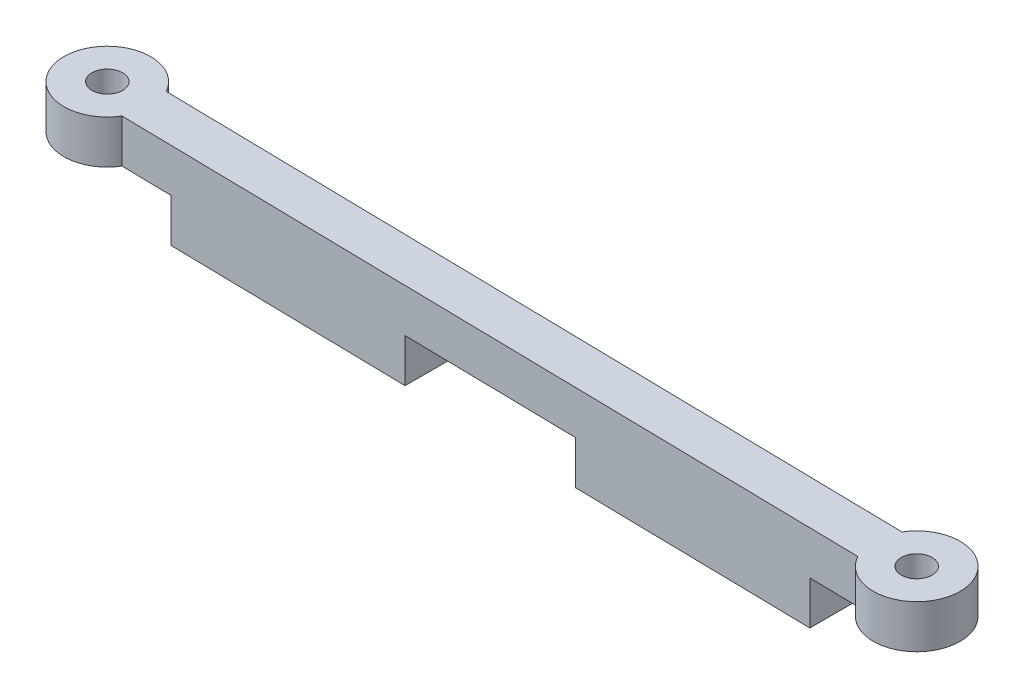
ISO-10303-21;
HEADER;
FILE_DESCRIPTION(('STEP AP214'),'2;1');
FILE_NAME('part.step','',(''),(''),'','','');
FILE_SCHEMA(('AUTOMOTIVE_DESIGN { 1 0 10303 214 1 1 1 1 }'));
ENDSEC;
DATA;
#1=APPLICATION_CONTEXT('core data for automotive mechanical design processes');
#2=APPLICATION_PROTOCOL_DEFINITION('international standard','automotive_design',2000,#1);
#3=PRODUCT_CONTEXT('',#1,'mechanical');
#4=PRODUCT('Part','Part','',(#3));
#5=PRODUCT_RELATED_PRODUCT_CATEGORY('part','',(#4));
#6=PRODUCT_DEFINITION_FORMATION('','',#4);
#7=PRODUCT_DEFINITION_CONTEXT('part definition',#1,'design');
#8=PRODUCT_DEFINITION('design','',#6,#7);
#9=PRODUCT_DEFINITION_SHAPE('','',#8);
#10=(LENGTH_UNIT() NAMED_UNIT(*) SI_UNIT(.MILLI.,.METRE.));
#11=(NAMED_UNIT(*) PLANE_ANGLE_UNIT() SI_UNIT($,.RADIAN.));
#12=(NAMED_UNIT(*) SI_UNIT($,.STERADIAN.) SOLID_ANGLE_UNIT());
#13=UNCERTAINTY_MEASURE_WITH_UNIT(LENGTH_MEASURE(1.E-05),#10,'distance_accuracy_value','');
#14=(GEOMETRIC_REPRESENTATION_CONTEXT(3) GLOBAL_UNCERTAINTY_ASSIGNED_CONTEXT((#13)) GLOBAL_UNIT_ASSIGNED_CONTEXT((#10,
#11,#12)) REPRESENTATION_CONTEXT('',''));
#15=CARTESIAN_POINT('',(0.,0.,0.));
#16=DIRECTION('',(0.,0.,1.));
#17=DIRECTION('',(1.,0.,0.));
#18=AXIS2_PLACEMENT_3D('',#15,#16,#17);
#19=CARTESIAN_POINT('',(0.,0.,0.));
#20=DIRECTION('',(0.,1.,0.));
#21=DIRECTION('',(0.,0.,1.));
#22=AXIS2_PLACEMENT_3D('',#19,#20,#21);
#23=PLANE('',#22);
#24=DIRECTION('',(0.99983433393639,0.,0.0182017768905994));
#25=VECTOR('',#24,1.);
#26=CARTESIAN_POINT('',(-0.0577810676795412,0.,3.17394810763473));
#27=LINE('',#26,#25);
#28=CARTESIAN_POINT('',(73.025,0.,4.50440499472844));
#29=VERTEX_POINT('',#28);
#30=CARTESIAN_POINT('',(107.95,0.,5.14020738351161));
#31=VERTEX_POINT('',#30);
#32=EDGE_CURVE('E251',#29,#31,#27,.T.);
#33=ORIENTED_EDGE('',*,*,#32,.F.);
#34=DIRECTION('',(0.,0.,1.));
#35=VECTOR('',#34,1.);
#36=CARTESIAN_POINT('',(73.025,0.,-1.84559500527155));
#37=LINE('',#36,#35);
#38=CARTESIAN_POINT('',(73.025,0.,-1.84559500527155));
#39=VERTEX_POINT('',#38);
#40=EDGE_CURVE('E167',#39,#29,#37,.T.);
#41=ORIENTED_EDGE('',*,*,#40,.F.);
#42=DIRECTION('',(-0.99983433393639,0.,-0.0182017768905994));
#43=VECTOR('',#42,1.);
#44=CARTESIAN_POINT('',(0.0577810676795413,0.,-3.17394810763473));
#45=LINE('',#44,#43);
#46=CARTESIAN_POINT('',(107.95,0.,-1.20979261648838));
#47=VERTEX_POINT('',#46);
#48=EDGE_CURVE('E248',#47,#39,#45,.T.);
#49=ORIENTED_EDGE('',*,*,#48,.F.);
#50=DIRECTION('',(0.,0.,1.));
#51=VECTOR('',#50,1.);
#52=CARTESIAN_POINT('',(107.95,0.,-1.20979261648838));
#53=LINE('',#52,#51);
#54=EDGE_CURVE('E184',#47,#31,#53,.T.);
#55=ORIENTED_EDGE('',*,*,#54,.T.);
#56=EDGE_LOOP('',(#33,#41,#49,#55));
#57=FACE_BOUND('',#56,.T.);
#58=ADVANCED_FACE('F60',(#57),#23,.F.);
#59=CARTESIAN_POINT('',(120.65,12.7,2.19640825216004));
#60=DIRECTION('',(0.,-1.,0.));
#61=DIRECTION('',(0.,0.,-1.));
#62=AXIS2_PLACEMENT_3D('',#59,#60,#61);
#63=CYLINDRICAL_SURFACE('',#62,6.35000000000001);
#64=CARTESIAN_POINT('',(120.65,6.35,2.19640825216004));
#65=DIRECTION('',(0.,-1.,0.));
#66=DIRECTION('',(0.,0.,-1.));
#67=AXIS2_PLACEMENT_3D('',#64,#65,#66);
#68=CIRCLE('',#67,6.35000000000001);
#69=CARTESIAN_POINT('',(115.20912719814,6.35,-1.07764170988686));
#70=VERTEX_POINT('',#69);
#71=CARTESIAN_POINT('',(115.093565062781,6.35,5.27025450538259));
#72=VERTEX_POINT('',#71);
#73=EDGE_CURVE('E216',#70,#72,#68,.T.);
#74=ORIENTED_EDGE('',*,*,#73,.F.);
#75=CARTESIAN_POINT('',(115.20912719814,12.7,-1.07764170988686));
#76=DIRECTION('',(0.,-1.,0.));
#77=VECTOR('',#76,1.);
#78=LINE('',#75,#77);
#79=CARTESIAN_POINT('',(115.20912719814,12.7,-1.07764170988686));
#80=VERTEX_POINT('',#79);
#81=EDGE_CURVE('E70',#80,#70,#78,.T.);
#82=ORIENTED_EDGE('',*,*,#81,.F.);
#83=CARTESIAN_POINT('',(120.65,12.7,2.19640825216004));
#84=DIRECTION('',(0.,1.,0.));
#85=DIRECTION('',(0.,0.,1.));
#86=AXIS2_PLACEMENT_3D('',#83,#84,#85);
#87=CIRCLE('',#86,6.35000000000001);
#88=CARTESIAN_POINT('',(115.093565062781,12.7,5.27025450538259));
#89=VERTEX_POINT('',#88);
#90=EDGE_CURVE('E222',#89,#80,#87,.T.);
#91=ORIENTED_EDGE('',*,*,#90,.F.);
#92=CARTESIAN_POINT('',(115.093565062781,12.7,5.2702545053826));
#93=DIRECTION('',(0.,-1.,0.));
#94=VECTOR('',#93,1.);
#95=LINE('',#92,#94);
#96=EDGE_CURVE('E241',#89,#72,#95,.T.);
#97=ORIENTED_EDGE('',*,*,#96,.T.);
#98=EDGE_LOOP('',(#74,#82,#91,#97));
#99=FACE_BOUND('',#98,.T.);
#100=ADVANCED_FACE('F287',(#99),#63,.T.);
#101=CARTESIAN_POINT('',(0.0577810676795413,12.7,-3.17394810763473));
#102=DIRECTION('',(-0.0182017768905994,0.,0.99983433393639));
#103=DIRECTION('',(0.99983433393639,0.,0.0182017768905994));
#104=AXIS2_PLACEMENT_3D('',#101,#102,#103);
#105=PLANE('',#104);
#106=ORIENTED_EDGE('',*,*,#48,.T.);
#107=DIRECTION('',(0.,-1.,0.));
#108=VECTOR('',#107,1.);
#109=CARTESIAN_POINT('',(73.025,6.35,-1.84559500527155));
#110=LINE('',#109,#108);
#111=CARTESIAN_POINT('',(73.025,6.35,-1.84559500527155));
#112=VERTEX_POINT('',#111);
#113=EDGE_CURVE('E175',#112,#39,#110,.T.);
#114=ORIENTED_EDGE('',*,*,#113,.F.);
#115=DIRECTION('',(0.99983433393639,0.,0.0182017768905997));
#116=VECTOR('',#115,1.);
#117=CARTESIAN_POINT('',(47.625,6.35,-2.3079967425684));
#118=LINE('',#117,#116);
#119=CARTESIAN_POINT('',(47.625,6.35,-2.3079967425684));
#120=VERTEX_POINT('',#119);
#121=EDGE_CURVE('E157',#120,#112,#118,.T.);
#122=ORIENTED_EDGE('',*,*,#121,.F.);
#123=DIRECTION('',(0.,-1.,0.));
#124=VECTOR('',#123,1.);
#125=CARTESIAN_POINT('',(47.625,6.35,-2.3079967425684));
#126=LINE('',#125,#124);
#127=CARTESIAN_POINT('',(47.625,0.,-2.3079967425684));
#128=VERTEX_POINT('',#127);
#129=EDGE_CURVE('E154',#120,#128,#126,.T.);
#130=ORIENTED_EDGE('',*,*,#129,.T.);
#131=CARTESIAN_POINT('',(12.7,0.,-2.94379913135157));
#132=VERTEX_POINT('',#131);
#133=EDGE_CURVE('E64',#128,#132,#45,.T.);
#134=ORIENTED_EDGE('',*,*,#133,.T.);
#135=DIRECTION('',(0.,-1.,0.));
#136=VECTOR('',#135,1.);
#137=CARTESIAN_POINT('',(12.7,6.35,-2.94379913135157));
#138=LINE('',#137,#136);
#139=CARTESIAN_POINT('',(12.7,6.35,-2.94379913135157));
#140=VERTEX_POINT('',#139);
#141=EDGE_CURVE('E191',#140,#132,#138,.T.);
#142=ORIENTED_EDGE('',*,*,#141,.F.);
#143=DIRECTION('',(0.99983433393639,0.,0.0182017768905994));
#144=VECTOR('',#143,1.);
#145=CARTESIAN_POINT('',(0.0577810676795413,6.35,-3.17394810763473));
#146=LINE('',#145,#144);
#147=CARTESIAN_POINT('',(5.55643493721916,6.35,-3.07384625322256));
#148=VERTEX_POINT('',#147);
#149=EDGE_CURVE('E201',#148,#140,#146,.T.);
#150=ORIENTED_EDGE('',*,*,#149,.F.);
#151=CARTESIAN_POINT('',(5.55643493721916,12.7,-3.07384625322255));
#152=DIRECTION('',(0.,-1.,0.));
#153=VECTOR('',#152,1.);
#154=LINE('',#151,#153);
#155=CARTESIAN_POINT('',(5.55643493721916,12.7,-3.07384625322256));
#156=VERTEX_POINT('',#155);
#157=EDGE_CURVE('E339',#156,#148,#154,.T.);
#158=ORIENTED_EDGE('',*,*,#157,.F.);
#159=DIRECTION('',(-0.99983433393639,0.,-0.0182017768905994));
#160=VECTOR('',#159,1.);
#161=CARTESIAN_POINT('',(0.0577810676795413,12.7,-3.17394810763473));
#162=LINE('',#161,#160);
#163=EDGE_CURVE('E225',#80,#156,#162,.T.);
#164=ORIENTED_EDGE('',*,*,#163,.F.);
#165=ORIENTED_EDGE('',*,*,#81,.T.);
#166=DIRECTION('',(0.99983433393639,0.,0.0182017768905994));
#167=VECTOR('',#166,1.);
#168=CARTESIAN_POINT('',(0.0577810676795413,6.35,-3.17394810763473));
#169=LINE('',#168,#167);
#170=CARTESIAN_POINT('',(107.95,6.35,-1.20979261648838));
#171=VERTEX_POINT('',#170);
#172=EDGE_CURVE('E209',#171,#70,#169,.T.);
#173=ORIENTED_EDGE('',*,*,#172,.F.);
#174=DIRECTION('',(0.,-1.,0.));
#175=VECTOR('',#174,1.);
#176=CARTESIAN_POINT('',(107.95,6.35,-1.20979261648838));
#177=LINE('',#176,#175);
#178=EDGE_CURVE('E183',#171,#47,#177,.T.);
#179=ORIENTED_EDGE('',*,*,#178,.T.);
#180=EDGE_LOOP('',(#106,#114,#122,#130,#134,#142,#150,#158,#164,#165,#173,#179));
#181=FACE_BOUND('',#180,.T.);
#182=ADVANCED_FACE('F274',(#181),#105,.F.);
#183=CARTESIAN_POINT('',(0.,12.7,0.));
#184=DIRECTION('',(0.,-1.,0.));
#185=DIRECTION('',(0.,0.,-1.));
#186=AXIS2_PLACEMENT_3D('',#183,#184,#185);
#187=CYLINDRICAL_SURFACE('',#186,6.35);
#188=CARTESIAN_POINT('',(0.,6.35,0.));
#189=DIRECTION('',(0.,-1.,0.));
#190=DIRECTION('',(0.,0.,-1.));
#191=AXIS2_PLACEMENT_3D('',#188,#189,#190);
#192=CIRCLE('',#191,6.35);
#193=CARTESIAN_POINT('',(5.44087280186007,6.35,3.2740499620469));
#194=VERTEX_POINT('',#193);
#195=EDGE_CURVE('E254',#194,#148,#192,.T.);
#196=ORIENTED_EDGE('',*,*,#195,.F.);
#197=CARTESIAN_POINT('',(5.44087280186007,12.7,3.2740499620469));
#198=DIRECTION('',(0.,-1.,0.));
#199=VECTOR('',#198,1.);
#200=LINE('',#197,#199);
#201=CARTESIAN_POINT('',(5.44087280186007,12.7,3.2740499620469));
#202=VERTEX_POINT('',#201);
#203=EDGE_CURVE('E289',#202,#194,#200,.T.);
#204=ORIENTED_EDGE('',*,*,#203,.F.);
#205=CARTESIAN_POINT('',(0.,12.7,0.));
#206=DIRECTION('',(0.,1.,0.));
#207=DIRECTION('',(0.,0.,1.));
#208=AXIS2_PLACEMENT_3D('',#205,#206,#207);
#209=CIRCLE('',#208,6.35);
#210=EDGE_CURVE('E229',#156,#202,#209,.T.);
#211=ORIENTED_EDGE('',*,*,#210,.F.);
#212=ORIENTED_EDGE('',*,*,#157,.T.);
#213=EDGE_LOOP('',(#196,#204,#211,#212));
#214=FACE_BOUND('',#213,.T.);
#215=ADVANCED_FACE('F344',(#214),#187,.T.);
#216=CARTESIAN_POINT('',(-0.0577810676795412,12.7,3.17394810763473));
#217=DIRECTION('',(0.0182017768905994,0.,-0.99983433393639));
#218=DIRECTION('',(-0.99983433393639,0.,-0.0182017768905994));
#219=AXIS2_PLACEMENT_3D('',#216,#217,#218);
#220=PLANE('',#219);
#221=DIRECTION('',(-0.99983433393639,0.,-0.0182017768905995));
#222=VECTOR('',#221,1.);
#223=CARTESIAN_POINT('',(73.025,6.35,4.50440499472844));
#224=LINE('',#223,#222);
#225=CARTESIAN_POINT('',(73.025,6.35,4.50440499472844));
#226=VERTEX_POINT('',#225);
#227=CARTESIAN_POINT('',(47.625,6.35,4.04200325743159));
#228=VERTEX_POINT('',#227);
#229=EDGE_CURVE('E158',#226,#228,#224,.T.);
#230=ORIENTED_EDGE('',*,*,#229,.F.);
#231=DIRECTION('',(0.,-1.,0.));
#232=VECTOR('',#231,1.);
#233=CARTESIAN_POINT('',(73.025,6.35,4.50440499472844));
#234=LINE('',#233,#232);
#235=EDGE_CURVE('E196',#226,#29,#234,.T.);
#236=ORIENTED_EDGE('',*,*,#235,.T.);
#237=ORIENTED_EDGE('',*,*,#32,.T.);
#238=DIRECTION('',(0.,-1.,0.));
#239=VECTOR('',#238,1.);
#240=CARTESIAN_POINT('',(107.95,12.7,5.14020738351161));
#241=LINE('',#240,#239);
#242=CARTESIAN_POINT('',(107.95,6.35,5.14020738351161));
#243=VERTEX_POINT('',#242);
#244=EDGE_CURVE('E190',#243,#31,#241,.T.);
#245=ORIENTED_EDGE('',*,*,#244,.F.);
#246=DIRECTION('',(-0.99983433393639,0.,-0.0182017768905994));
#247=VECTOR('',#246,1.);
#248=CARTESIAN_POINT('',(-0.0577810676795412,6.35,3.17394810763473));
#249=LINE('',#248,#247);
#250=EDGE_CURVE('E207',#72,#243,#249,.T.);
#251=ORIENTED_EDGE('',*,*,#250,.F.);
#252=ORIENTED_EDGE('',*,*,#96,.F.);
#253=DIRECTION('',(0.99983433393639,0.,0.0182017768905994));
#254=VECTOR('',#253,1.);
#255=CARTESIAN_POINT('',(-0.0577810676795412,12.7,3.17394810763473));
#256=LINE('',#255,#254);
#257=EDGE_CURVE('E233',#202,#89,#256,.T.);
#258=ORIENTED_EDGE('',*,*,#257,.F.);
#259=ORIENTED_EDGE('',*,*,#203,.T.);
#260=DIRECTION('',(-0.99983433393639,0.,-0.0182017768905994));
#261=VECTOR('',#260,1.);
#262=CARTESIAN_POINT('',(-0.0577810676795412,6.35,3.17394810763473));
#263=LINE('',#262,#261);
#264=CARTESIAN_POINT('',(12.7,6.35,3.40620086864842));
#265=VERTEX_POINT('',#264);
#266=EDGE_CURVE('E204',#265,#194,#263,.T.);
#267=ORIENTED_EDGE('',*,*,#266,.F.);
#268=DIRECTION('',(0.,-1.,0.));
#269=VECTOR('',#268,1.);
#270=CARTESIAN_POINT('',(12.7,6.35,3.40620086864842));
#271=LINE('',#270,#269);
#272=CARTESIAN_POINT('',(12.7,0.,3.40620086864842));
#273=VERTEX_POINT('',#272);
#274=EDGE_CURVE('E194',#265,#273,#271,.T.);
#275=ORIENTED_EDGE('',*,*,#274,.T.);
#276=CARTESIAN_POINT('',(47.625,0.,4.04200325743159));
#277=VERTEX_POINT('',#276);
#278=EDGE_CURVE('E173',#273,#277,#27,.T.);
#279=ORIENTED_EDGE('',*,*,#278,.T.);
#280=DIRECTION('',(0.,-1.,0.));
#281=VECTOR('',#280,1.);
#282=CARTESIAN_POINT('',(47.625,6.35,4.04200325743159));
#283=LINE('',#282,#281);
#284=EDGE_CURVE('E78',#228,#277,#283,.T.);
#285=ORIENTED_EDGE('',*,*,#284,.F.);
#286=EDGE_LOOP('',(#230,#236,#237,#245,#251,#252,#258,#259,#267,#275,#279,#285));
#287=FACE_BOUND('',#286,.T.);
#288=ADVANCED_FACE('F170',(#287),#220,.F.);
#289=CARTESIAN_POINT('',(120.65,12.7,2.19640825216004));
#290=DIRECTION('',(0.,-1.,0.));
#291=DIRECTION('',(0.,0.,-1.));
#292=AXIS2_PLACEMENT_3D('',#289,#290,#291);
#293=CYLINDRICAL_SURFACE('',#292,2.2479);
#294=CARTESIAN_POINT('',(120.65,12.7,2.19640825216004));
#295=DIRECTION('',(0.,1.,0.));
#296=DIRECTION('',(0.,0.,1.));
#297=AXIS2_PLACEMENT_3D('',#294,#295,#296);
#298=CIRCLE('',#297,2.2479);
#299=CARTESIAN_POINT('',(120.65,12.7,4.44430825216004));
#300=VERTEX_POINT('',#299);
#301=EDGE_CURVE('E219',#300,#300,#298,.T.);
#302=ORIENTED_EDGE('',*,*,#301,.T.);
#303=EDGE_LOOP('',(#302));
#304=FACE_BOUND('',#303,.T.);
#305=CARTESIAN_POINT('',(120.65,6.35,2.19640825216004));
#306=DIRECTION('',(0.,-1.,0.));
#307=DIRECTION('',(0.,0.,-1.));
#308=AXIS2_PLACEMENT_3D('',#305,#306,#307);
#309=CIRCLE('',#308,2.2479);
#310=CARTESIAN_POINT('',(120.65,6.35,-0.0514917478399682));
#311=VERTEX_POINT('',#310);
#312=EDGE_CURVE('E12',#311,#311,#309,.T.);
#313=ORIENTED_EDGE('',*,*,#312,.T.);
#314=EDGE_LOOP('',(#313));
#315=FACE_BOUND('',#314,.T.);
#316=ADVANCED_FACE('F62',(#304,#315),#293,.F.);
#317=CARTESIAN_POINT('',(0.,12.7,0.));
#318=DIRECTION('',(0.,-1.,0.));
#319=DIRECTION('',(0.,0.,-1.));
#320=AXIS2_PLACEMENT_3D('',#317,#318,#319);
#321=CYLINDRICAL_SURFACE('',#320,2.2479);
#322=CARTESIAN_POINT('',(0.,12.7,0.));
#323=DIRECTION('',(0.,1.,0.));
#324=DIRECTION('',(0.,0.,1.));
#325=AXIS2_PLACEMENT_3D('',#322,#323,#324);
#326=CIRCLE('',#325,2.2479);
#327=CARTESIAN_POINT('',(0.,12.7,2.2479));
#328=VERTEX_POINT('',#327);
#329=EDGE_CURVE('E237',#328,#328,#326,.T.);
#330=ORIENTED_EDGE('',*,*,#329,.T.);
#331=EDGE_LOOP('',(#330));
#332=FACE_BOUND('',#331,.T.);
#333=CARTESIAN_POINT('',(0.,6.35,0.));
#334=DIRECTION('',(0.,-1.,0.));
#335=DIRECTION('',(0.,0.,-1.));
#336=AXIS2_PLACEMENT_3D('',#333,#334,#335);
#337=CIRCLE('',#336,2.2479);
#338=CARTESIAN_POINT('',(0.,6.35,-2.2479));
#339=VERTEX_POINT('',#338);
#340=EDGE_CURVE('E199',#339,#339,#337,.F.);
#341=ORIENTED_EDGE('',*,*,#340,.F.);
#342=EDGE_LOOP('',(#341));
#343=FACE_BOUND('',#342,.T.);
#344=ADVANCED_FACE('F358',(#332,#343),#321,.F.);
#345=ORIENTED_EDGE('',*,*,#133,.F.);
#346=DIRECTION('',(0.,0.,-1.));
#347=VECTOR('',#346,1.);
#348=CARTESIAN_POINT('',(47.625,0.,4.04200325743159));
#349=LINE('',#348,#347);
#350=EDGE_CURVE('E401',#277,#128,#349,.T.);
#351=ORIENTED_EDGE('',*,*,#350,.F.);
#352=ORIENTED_EDGE('',*,*,#278,.F.);
#353=DIRECTION('',(0.,0.,-1.));
#354=VECTOR('',#353,1.);
#355=CARTESIAN_POINT('',(12.7,0.,0.));
#356=LINE('',#355,#354);
#357=EDGE_CURVE('E187',#273,#132,#356,.T.);
#358=ORIENTED_EDGE('',*,*,#357,.T.);
#359=EDGE_LOOP('',(#345,#351,#352,#358));
#360=FACE_BOUND('',#359,.T.);
#361=ADVANCED_FACE('F385',(#360),#23,.F.);
#362=CARTESIAN_POINT('',(0.,12.7,0.));
#363=DIRECTION('',(0.,1.,0.));
#364=DIRECTION('',(0.,0.,1.));
#365=AXIS2_PLACEMENT_3D('',#362,#363,#364);
#366=PLANE('',#365);
#367=ORIENTED_EDGE('',*,*,#301,.F.);
#368=EDGE_LOOP('',(#367));
#369=FACE_BOUND('',#368,.T.);
#370=ORIENTED_EDGE('',*,*,#90,.T.);
#371=ORIENTED_EDGE('',*,*,#163,.T.);
#372=ORIENTED_EDGE('',*,*,#210,.T.);
#373=ORIENTED_EDGE('',*,*,#257,.T.);
#374=EDGE_LOOP('',(#370,#371,#372,#373));
#375=FACE_BOUND('',#374,.T.);
#376=ORIENTED_EDGE('',*,*,#329,.F.);
#377=EDGE_LOOP('',(#376));
#378=FACE_BOUND('',#377,.T.);
#379=ADVANCED_FACE('F381',(#369,#375,#378),#366,.T.);
#380=CARTESIAN_POINT('',(12.7,6.35,0.));
#381=DIRECTION('',(-1.,0.,0.));
#382=DIRECTION('',(0.,0.,1.));
#383=AXIS2_PLACEMENT_3D('',#380,#381,#382);
#384=PLANE('',#383);
#385=ORIENTED_EDGE('',*,*,#357,.F.);
#386=ORIENTED_EDGE('',*,*,#274,.F.);
#387=DIRECTION('',(0.,0.,-1.));
#388=VECTOR('',#387,1.);
#389=CARTESIAN_POINT('',(12.7,6.35,0.));
#390=LINE('',#389,#388);
#391=EDGE_CURVE('E193',#265,#140,#390,.T.);
#392=ORIENTED_EDGE('',*,*,#391,.T.);
#393=ORIENTED_EDGE('',*,*,#141,.T.);
#394=EDGE_LOOP('',(#385,#386,#392,#393));
#395=FACE_BOUND('',#394,.T.);
#396=ADVANCED_FACE('F384',(#395),#384,.T.);
#397=CARTESIAN_POINT('',(0.,6.35,0.));
#398=DIRECTION('',(0.,-1.,0.));
#399=DIRECTION('',(0.,0.,-1.));
#400=AXIS2_PLACEMENT_3D('',#397,#398,#399);
#401=PLANE('',#400);
#402=ORIENTED_EDGE('',*,*,#340,.T.);
#403=EDGE_LOOP('',(#402));
#404=FACE_BOUND('',#403,.T.);
#405=ORIENTED_EDGE('',*,*,#266,.T.);
#406=ORIENTED_EDGE('',*,*,#195,.T.);
#407=ORIENTED_EDGE('',*,*,#149,.T.);
#408=ORIENTED_EDGE('',*,*,#391,.F.);
#409=EDGE_LOOP('',(#405,#406,#407,#408));
#410=FACE_BOUND('',#409,.T.);
#411=ADVANCED_FACE('F394',(#404,#410),#401,.T.);
#412=CARTESIAN_POINT('',(0.,6.35,0.));
#413=DIRECTION('',(0.,-1.,0.));
#414=DIRECTION('',(0.,0.,-1.));
#415=AXIS2_PLACEMENT_3D('',#412,#413,#414);
#416=PLANE('',#415);
#417=ORIENTED_EDGE('',*,*,#312,.F.);
#418=EDGE_LOOP('',(#417));
#419=FACE_BOUND('',#418,.T.);
#420=ORIENTED_EDGE('',*,*,#73,.T.);
#421=ORIENTED_EDGE('',*,*,#250,.T.);
#422=DIRECTION('',(0.,0.,1.));
#423=VECTOR('',#422,1.);
#424=CARTESIAN_POINT('',(107.95,6.35,-1.20979261648838));
#425=LINE('',#424,#423);
#426=EDGE_CURVE('E180',#171,#243,#425,.T.);
#427=ORIENTED_EDGE('',*,*,#426,.F.);
#428=ORIENTED_EDGE('',*,*,#172,.T.);
#429=EDGE_LOOP('',(#420,#421,#427,#428));
#430=FACE_BOUND('',#429,.T.);
#431=ADVANCED_FACE('F278',(#419,#430),#416,.T.);
#432=CARTESIAN_POINT('',(107.95,6.35,-1.20979261648838));
#433=DIRECTION('',(1.,0.,0.));
#434=DIRECTION('',(0.,0.,-1.));
#435=AXIS2_PLACEMENT_3D('',#432,#433,#434);
#436=PLANE('',#435);
#437=ORIENTED_EDGE('',*,*,#244,.T.);
#438=ORIENTED_EDGE('',*,*,#54,.F.);
#439=ORIENTED_EDGE('',*,*,#178,.F.);
#440=ORIENTED_EDGE('',*,*,#426,.T.);
#441=EDGE_LOOP('',(#437,#438,#439,#440));
#442=FACE_BOUND('',#441,.T.);
#443=ADVANCED_FACE('F270',(#442),#436,.T.);
#444=CARTESIAN_POINT('',(73.025,6.35,-1.84559500527155));
#445=DIRECTION('',(1.,0.,0.));
#446=DIRECTION('',(0.,0.,-1.));
#447=AXIS2_PLACEMENT_3D('',#444,#445,#446);
#448=PLANE('',#447);
#449=ORIENTED_EDGE('',*,*,#40,.T.);
#450=ORIENTED_EDGE('',*,*,#235,.F.);
#451=DIRECTION('',(0.,0.,1.));
#452=VECTOR('',#451,1.);
#453=CARTESIAN_POINT('',(73.025,6.35,-1.84559500527155));
#454=LINE('',#453,#452);
#455=EDGE_CURVE('E164',#112,#226,#454,.T.);
#456=ORIENTED_EDGE('',*,*,#455,.F.);
#457=ORIENTED_EDGE('',*,*,#113,.T.);
#458=EDGE_LOOP('',(#449,#450,#456,#457));
#459=FACE_BOUND('',#458,.T.);
#460=ADVANCED_FACE('F407',(#459),#448,.F.);
#461=CARTESIAN_POINT('',(47.625,6.35,4.04200325743159));
#462=DIRECTION('',(-1.,0.,0.));
#463=DIRECTION('',(0.,0.,1.));
#464=AXIS2_PLACEMENT_3D('',#461,#462,#463);
#465=PLANE('',#464);
#466=ORIENTED_EDGE('',*,*,#350,.T.);
#467=ORIENTED_EDGE('',*,*,#129,.F.);
#468=DIRECTION('',(0.,0.,-1.));
#469=VECTOR('',#468,1.);
#470=CARTESIAN_POINT('',(47.625,6.35,4.04200325743159));
#471=LINE('',#470,#469);
#472=EDGE_CURVE('E151',#228,#120,#471,.T.);
#473=ORIENTED_EDGE('',*,*,#472,.F.);
#474=ORIENTED_EDGE('',*,*,#284,.T.);
#475=EDGE_LOOP('',(#466,#467,#473,#474));
#476=FACE_BOUND('',#475,.T.);
#477=ADVANCED_FACE('F153',(#476),#465,.F.);
#478=CARTESIAN_POINT('',(0.,6.35,0.));
#479=DIRECTION('',(0.,-1.,0.));
#480=DIRECTION('',(0.,0.,-1.));
#481=AXIS2_PLACEMENT_3D('',#478,#479,#480);
#482=PLANE('',#481);
#483=ORIENTED_EDGE('',*,*,#229,.T.);
#484=ORIENTED_EDGE('',*,*,#472,.T.);
#485=ORIENTED_EDGE('',*,*,#121,.T.);
#486=ORIENTED_EDGE('',*,*,#455,.T.);
#487=EDGE_LOOP('',(#483,#484,#485,#486));
#488=FACE_BOUND('',#487,.T.);
#489=ADVANCED_FACE('F162',(#488),#482,.T.);
#490=CLOSED_SHELL('',(#58,#100,#182,#215,#288,#316,#344,#361,#379,#396,#411,#431,#443,#460,#477,#489));
#491=MANIFOLD_SOLID_BREP('B2',#490);
#492=ADVANCED_BREP_SHAPE_REPRESENTATION('',(#18,#491),#14);
#493=SHAPE_DEFINITION_REPRESENTATION(#9,#492);
ENDSEC;
END-ISO-10303-21;
